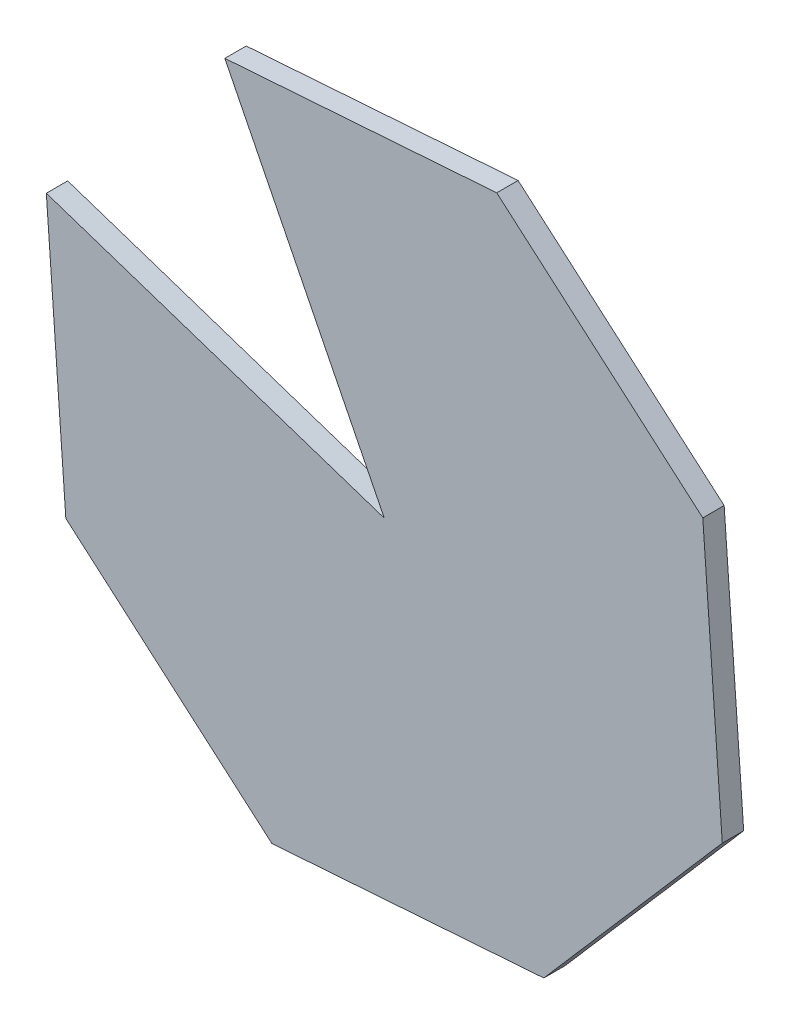
ISO-10303-21;
HEADER;
FILE_DESCRIPTION(('STEP AP214'),'2;1');
FILE_NAME('part.step','',(''),(''),'','','');
FILE_SCHEMA(('AUTOMOTIVE_DESIGN { 1 0 10303 214 1 1 1 1 }'));
ENDSEC;
DATA;
#1=APPLICATION_CONTEXT('core data for automotive mechanical design processes');
#2=APPLICATION_PROTOCOL_DEFINITION('international standard','automotive_design',2000,#1);
#3=PRODUCT_CONTEXT('',#1,'mechanical');
#4=PRODUCT('Part','Part','',(#3));
#5=PRODUCT_RELATED_PRODUCT_CATEGORY('part','',(#4));
#6=PRODUCT_DEFINITION_FORMATION('','',#4);
#7=PRODUCT_DEFINITION_CONTEXT('part definition',#1,'design');
#8=PRODUCT_DEFINITION('design','',#6,#7);
#9=PRODUCT_DEFINITION_SHAPE('','',#8);
#10=(LENGTH_UNIT() NAMED_UNIT(*) SI_UNIT(.MILLI.,.METRE.));
#11=(NAMED_UNIT(*) PLANE_ANGLE_UNIT() SI_UNIT($,.RADIAN.));
#12=(NAMED_UNIT(*) SI_UNIT($,.STERADIAN.) SOLID_ANGLE_UNIT());
#13=UNCERTAINTY_MEASURE_WITH_UNIT(LENGTH_MEASURE(1.E-05),#10,'distance_accuracy_value','');
#14=(GEOMETRIC_REPRESENTATION_CONTEXT(3) GLOBAL_UNCERTAINTY_ASSIGNED_CONTEXT((#13)) GLOBAL_UNIT_ASSIGNED_CONTEXT((#10,
#11,#12)) REPRESENTATION_CONTEXT('',''));
#15=CARTESIAN_POINT('',(0.,0.,0.));
#16=DIRECTION('',(0.,0.,1.));
#17=DIRECTION('',(1.,0.,0.));
#18=AXIS2_PLACEMENT_3D('',#15,#16,#17);
#19=CARTESIAN_POINT('',(0.,0.,3.));
#20=DIRECTION('',(-0.315635887196089,-0.948880385883246,0.));
#21=DIRECTION('',(0.948880385883246,-0.315635887196089,0.));
#22=AXIS2_PLACEMENT_3D('',#19,#20,#21);
#23=PLANE('',#22);
#24=DIRECTION('',(-0.948880385883246,0.315635887196089,0.));
#25=VECTOR('',#24,1.);
#26=CARTESIAN_POINT('',(0.,0.,0.));
#27=LINE('',#26,#25);
#28=CARTESIAN_POINT('',(0.,0.,0.));
#29=VERTEX_POINT('',#28);
#30=CARTESIAN_POINT('',(-47.4440192941623,15.7817943598045,0.));
#31=VERTEX_POINT('',#30);
#32=EDGE_CURVE('E135',#29,#31,#27,.T.);
#33=ORIENTED_EDGE('',*,*,#32,.T.);
#34=DIRECTION('',(0.,0.,-1.));
#35=VECTOR('',#34,1.);
#36=CARTESIAN_POINT('',(-47.4440192941623,15.7817943598045,3.));
#37=LINE('',#36,#35);
#38=CARTESIAN_POINT('',(-47.4440192941623,15.7817943598045,3.));
#39=VERTEX_POINT('',#38);
#40=EDGE_CURVE('E11',#39,#31,#37,.T.);
#41=ORIENTED_EDGE('',*,*,#40,.F.);
#42=DIRECTION('',(-0.948880385883246,0.315635887196089,0.));
#43=VECTOR('',#42,1.);
#44=CARTESIAN_POINT('',(0.,0.,3.));
#45=LINE('',#44,#43);
#46=CARTESIAN_POINT('',(0.,0.,3.));
#47=VERTEX_POINT('',#46);
#48=EDGE_CURVE('E151',#47,#39,#45,.T.);
#49=ORIENTED_EDGE('',*,*,#48,.F.);
#50=DIRECTION('',(0.,0.,-1.));
#51=VECTOR('',#50,1.);
#52=CARTESIAN_POINT('',(0.,0.,3.));
#53=LINE('',#52,#51);
#54=EDGE_CURVE('E131',#47,#29,#53,.T.);
#55=ORIENTED_EDGE('',*,*,#54,.T.);
#56=EDGE_LOOP('',(#33,#41,#49,#55));
#57=FACE_BOUND('',#56,.T.);
#58=ADVANCED_FACE('F33',(#57),#23,.F.);
#59=CARTESIAN_POINT('',(-47.4440192941623,15.7817943598045,3.));
#60=DIRECTION('',(0.997439792008742,0.0715112670672036,0.));
#61=DIRECTION('',(-0.0715112670672036,0.997439792008742,0.));
#62=AXIS2_PLACEMENT_3D('',#59,#60,#61);
#63=PLANE('',#62);
#64=DIRECTION('',(0.0715112670672036,-0.997439792008742,0.));
#65=VECTOR('',#64,1.);
#66=CARTESIAN_POINT('',(-47.4440192941623,15.7817943598045,0.));
#67=LINE('',#66,#65);
#68=CARTESIAN_POINT('',(-44.7074015807569,-22.3885739585382,0.));
#69=VERTEX_POINT('',#68);
#70=EDGE_CURVE('E138',#31,#69,#67,.T.);
#71=ORIENTED_EDGE('',*,*,#70,.T.);
#72=DIRECTION('',(0.,0.,-1.));
#73=VECTOR('',#72,1.);
#74=CARTESIAN_POINT('',(-44.7074015807569,-22.3885739585382,3.));
#75=LINE('',#74,#73);
#76=CARTESIAN_POINT('',(-44.7074015807569,-22.3885739585382,3.));
#77=VERTEX_POINT('',#76);
#78=EDGE_CURVE('E41',#77,#69,#75,.T.);
#79=ORIENTED_EDGE('',*,*,#78,.F.);
#80=DIRECTION('',(0.0715112670672036,-0.997439792008742,0.));
#81=VECTOR('',#80,1.);
#82=CARTESIAN_POINT('',(-47.4440192941623,15.7817943598045,3.));
#83=LINE('',#82,#81);
#84=EDGE_CURVE('E95',#39,#77,#83,.T.);
#85=ORIENTED_EDGE('',*,*,#84,.F.);
#86=ORIENTED_EDGE('',*,*,#40,.T.);
#87=EDGE_LOOP('',(#71,#79,#85,#86));
#88=FACE_BOUND('',#87,.T.);
#89=ADVANCED_FACE('F194',(#88),#63,.F.);
#90=CARTESIAN_POINT('',(-44.7074015807569,-22.3885739585382,3.));
#91=DIRECTION('',(0.654730338880219,0.755862542629143,0.));
#92=DIRECTION('',(-0.755862542629143,0.654730338880219,0.));
#93=AXIS2_PLACEMENT_3D('',#90,#91,#92);
#94=PLANE('',#93);
#95=DIRECTION('',(0.755862542629143,-0.654730338880219,0.));
#96=VECTOR('',#95,1.);
#97=CARTESIAN_POINT('',(-44.7074015807569,-22.3885739585382,0.));
#98=LINE('',#97,#96);
#99=CARTESIAN_POINT('',(-15.7817943598045,-47.4440192941623,0.));
#100=VERTEX_POINT('',#99);
#101=EDGE_CURVE('E140',#69,#100,#98,.T.);
#102=ORIENTED_EDGE('',*,*,#101,.T.);
#103=DIRECTION('',(0.,0.,-1.));
#104=VECTOR('',#103,1.);
#105=CARTESIAN_POINT('',(-15.7817943598045,-47.4440192941623,3.));
#106=LINE('',#105,#104);
#107=CARTESIAN_POINT('',(-15.7817943598045,-47.4440192941623,3.));
#108=VERTEX_POINT('',#107);
#109=EDGE_CURVE('E161',#108,#100,#106,.T.);
#110=ORIENTED_EDGE('',*,*,#109,.F.);
#111=DIRECTION('',(0.755862542629143,-0.654730338880219,0.));
#112=VECTOR('',#111,1.);
#113=CARTESIAN_POINT('',(-44.7074015807569,-22.3885739585382,3.));
#114=LINE('',#113,#112);
#115=EDGE_CURVE('E169',#77,#108,#114,.T.);
#116=ORIENTED_EDGE('',*,*,#115,.F.);
#117=ORIENTED_EDGE('',*,*,#78,.T.);
#118=EDGE_LOOP('',(#102,#110,#116,#117));
#119=FACE_BOUND('',#118,.T.);
#120=ADVANCED_FACE('F167',(#119),#94,.F.);
#121=CARTESIAN_POINT('',(-15.7817943598045,-47.4440192941623,3.));
#122=DIRECTION('',(-0.0715112670672032,0.997439792008742,0.));
#123=DIRECTION('',(-0.997439792008742,-0.0715112670672033,0.));
#124=AXIS2_PLACEMENT_3D('',#121,#122,#123);
#125=PLANE('',#124);
#126=DIRECTION('',(0.997439792008742,0.0715112670672033,0.));
#127=VECTOR('',#126,1.);
#128=CARTESIAN_POINT('',(-15.7817943598045,-47.4440192941623,0.));
#129=LINE('',#128,#127);
#130=CARTESIAN_POINT('',(22.3885739585382,-44.7074015807569,0.));
#131=VERTEX_POINT('',#130);
#132=EDGE_CURVE('E142',#100,#131,#129,.T.);
#133=ORIENTED_EDGE('',*,*,#132,.T.);
#134=DIRECTION('',(0.,0.,-1.));
#135=VECTOR('',#134,1.);
#136=CARTESIAN_POINT('',(22.3885739585382,-44.7074015807569,3.));
#137=LINE('',#136,#135);
#138=CARTESIAN_POINT('',(22.3885739585382,-44.7074015807569,3.));
#139=VERTEX_POINT('',#138);
#140=EDGE_CURVE('E158',#139,#131,#137,.T.);
#141=ORIENTED_EDGE('',*,*,#140,.F.);
#142=DIRECTION('',(0.997439792008742,0.0715112670672033,0.));
#143=VECTOR('',#142,1.);
#144=CARTESIAN_POINT('',(-15.7817943598045,-47.4440192941623,3.));
#145=LINE('',#144,#143);
#146=EDGE_CURVE('E185',#108,#139,#145,.T.);
#147=ORIENTED_EDGE('',*,*,#146,.F.);
#148=ORIENTED_EDGE('',*,*,#109,.T.);
#149=EDGE_LOOP('',(#133,#141,#147,#148));
#150=FACE_BOUND('',#149,.T.);
#151=ADVANCED_FACE('F178',(#150),#125,.F.);
#152=CARTESIAN_POINT('',(22.3885739585382,-44.7074015807569,3.));
#153=DIRECTION('',(-0.755862542629143,0.654730338880219,0.));
#154=DIRECTION('',(-0.65473033888022,-0.755862542629143,0.));
#155=AXIS2_PLACEMENT_3D('',#152,#153,#154);
#156=PLANE('',#155);
#157=DIRECTION('',(0.654730338880219,0.755862542629143,0.));
#158=VECTOR('',#157,1.);
#159=CARTESIAN_POINT('',(22.3885739585382,-44.7074015807569,0.));
#160=LINE('',#159,#158);
#161=CARTESIAN_POINT('',(47.4440192941623,-15.7817943598044,0.));
#162=VERTEX_POINT('',#161);
#163=EDGE_CURVE('E144',#131,#162,#160,.T.);
#164=ORIENTED_EDGE('',*,*,#163,.T.);
#165=DIRECTION('',(0.,0.,-1.));
#166=VECTOR('',#165,1.);
#167=CARTESIAN_POINT('',(47.4440192941623,-15.7817943598044,3.));
#168=LINE('',#167,#166);
#169=CARTESIAN_POINT('',(47.4440192941623,-15.7817943598044,3.));
#170=VERTEX_POINT('',#169);
#171=EDGE_CURVE('E155',#170,#162,#168,.T.);
#172=ORIENTED_EDGE('',*,*,#171,.F.);
#173=DIRECTION('',(0.654730338880219,0.755862542629143,0.));
#174=VECTOR('',#173,1.);
#175=CARTESIAN_POINT('',(22.3885739585382,-44.7074015807569,3.));
#176=LINE('',#175,#174);
#177=EDGE_CURVE('E184',#139,#170,#176,.T.);
#178=ORIENTED_EDGE('',*,*,#177,.F.);
#179=ORIENTED_EDGE('',*,*,#140,.T.);
#180=EDGE_LOOP('',(#164,#172,#178,#179));
#181=FACE_BOUND('',#180,.T.);
#182=ADVANCED_FACE('F182',(#181),#156,.F.);
#183=CARTESIAN_POINT('',(47.4440192941623,-15.7817943598044,3.));
#184=DIRECTION('',(-0.997439792008742,-0.0715112670672033,0.));
#185=DIRECTION('',(0.0715112670672033,-0.997439792008742,0.));
#186=AXIS2_PLACEMENT_3D('',#183,#184,#185);
#187=PLANE('',#186);
#188=DIRECTION('',(-0.0715112670672033,0.997439792008742,0.));
#189=VECTOR('',#188,1.);
#190=CARTESIAN_POINT('',(47.4440192941623,-15.7817943598044,0.));
#191=LINE('',#190,#189);
#192=CARTESIAN_POINT('',(44.7074015807569,22.3885739585382,0.));
#193=VERTEX_POINT('',#192);
#194=EDGE_CURVE('E146',#162,#193,#191,.T.);
#195=ORIENTED_EDGE('',*,*,#194,.T.);
#196=DIRECTION('',(0.,0.,-1.));
#197=VECTOR('',#196,1.);
#198=CARTESIAN_POINT('',(44.7074015807569,22.3885739585382,3.));
#199=LINE('',#198,#197);
#200=CARTESIAN_POINT('',(44.7074015807569,22.3885739585382,3.));
#201=VERTEX_POINT('',#200);
#202=EDGE_CURVE('E126',#201,#193,#199,.T.);
#203=ORIENTED_EDGE('',*,*,#202,.F.);
#204=DIRECTION('',(-0.0715112670672033,0.997439792008742,0.));
#205=VECTOR('',#204,1.);
#206=CARTESIAN_POINT('',(47.4440192941623,-15.7817943598044,3.));
#207=LINE('',#206,#205);
#208=EDGE_CURVE('E117',#170,#201,#207,.T.);
#209=ORIENTED_EDGE('',*,*,#208,.F.);
#210=ORIENTED_EDGE('',*,*,#171,.T.);
#211=EDGE_LOOP('',(#195,#203,#209,#210));
#212=FACE_BOUND('',#211,.T.);
#213=ADVANCED_FACE('F206',(#212),#187,.F.);
#214=CARTESIAN_POINT('',(44.7074015807569,22.3885739585382,3.));
#215=DIRECTION('',(-0.65473033888022,-0.755862542629143,0.));
#216=DIRECTION('',(0.755862542629143,-0.65473033888022,0.));
#217=AXIS2_PLACEMENT_3D('',#214,#215,#216);
#218=PLANE('',#217);
#219=DIRECTION('',(-0.755862542629143,0.65473033888022,0.));
#220=VECTOR('',#219,1.);
#221=CARTESIAN_POINT('',(44.7074015807569,22.3885739585382,0.));
#222=LINE('',#221,#220);
#223=CARTESIAN_POINT('',(15.7817943598045,47.4440192941623,0.));
#224=VERTEX_POINT('',#223);
#225=EDGE_CURVE('E125',#193,#224,#222,.T.);
#226=ORIENTED_EDGE('',*,*,#225,.T.);
#227=DIRECTION('',(0.,0.,-1.));
#228=VECTOR('',#227,1.);
#229=CARTESIAN_POINT('',(15.7817943598045,47.4440192941623,3.));
#230=LINE('',#229,#228);
#231=CARTESIAN_POINT('',(15.7817943598045,47.4440192941623,3.));
#232=VERTEX_POINT('',#231);
#233=EDGE_CURVE('E122',#232,#224,#230,.T.);
#234=ORIENTED_EDGE('',*,*,#233,.F.);
#235=DIRECTION('',(-0.755862542629143,0.65473033888022,0.));
#236=VECTOR('',#235,1.);
#237=CARTESIAN_POINT('',(44.7074015807569,22.3885739585382,3.));
#238=LINE('',#237,#236);
#239=EDGE_CURVE('E111',#201,#232,#238,.T.);
#240=ORIENTED_EDGE('',*,*,#239,.F.);
#241=ORIENTED_EDGE('',*,*,#202,.T.);
#242=EDGE_LOOP('',(#226,#234,#240,#241));
#243=FACE_BOUND('',#242,.T.);
#244=ADVANCED_FACE('F123',(#243),#218,.F.);
#245=CARTESIAN_POINT('',(15.7817943598045,47.4440192941623,3.));
#246=DIRECTION('',(0.0715112670672032,-0.997439792008742,0.));
#247=DIRECTION('',(0.997439792008742,0.0715112670672032,0.));
#248=AXIS2_PLACEMENT_3D('',#245,#246,#247);
#249=PLANE('',#248);
#250=DIRECTION('',(-0.997439792008742,-0.0715112670672032,0.));
#251=VECTOR('',#250,1.);
#252=CARTESIAN_POINT('',(15.7817943598045,47.4440192941623,0.));
#253=LINE('',#252,#251);
#254=CARTESIAN_POINT('',(-22.3885739585382,44.7074015807569,0.));
#255=VERTEX_POINT('',#254);
#256=EDGE_CURVE('E81',#224,#255,#253,.T.);
#257=ORIENTED_EDGE('',*,*,#256,.T.);
#258=DIRECTION('',(0.,0.,-1.));
#259=VECTOR('',#258,1.);
#260=CARTESIAN_POINT('',(-22.3885739585382,44.7074015807569,3.));
#261=LINE('',#260,#259);
#262=CARTESIAN_POINT('',(-22.3885739585382,44.7074015807569,3.));
#263=VERTEX_POINT('',#262);
#264=EDGE_CURVE('E127',#263,#255,#261,.T.);
#265=ORIENTED_EDGE('',*,*,#264,.F.);
#266=DIRECTION('',(-0.997439792008742,-0.0715112670672032,0.));
#267=VECTOR('',#266,1.);
#268=CARTESIAN_POINT('',(15.7817943598045,47.4440192941623,3.));
#269=LINE('',#268,#267);
#270=EDGE_CURVE('E115',#232,#263,#269,.T.);
#271=ORIENTED_EDGE('',*,*,#270,.F.);
#272=ORIENTED_EDGE('',*,*,#233,.T.);
#273=EDGE_LOOP('',(#257,#265,#271,#272));
#274=FACE_BOUND('',#273,.T.);
#275=ADVANCED_FACE('F129',(#274),#249,.F.);
#276=CARTESIAN_POINT('',(0.,0.,3.));
#277=DIRECTION('',(0.894148031615138,0.447771479170764,0.));
#278=DIRECTION('',(-0.447771479170764,0.894148031615138,0.));
#279=AXIS2_PLACEMENT_3D('',#276,#277,#278);
#280=PLANE('',#279);
#281=DIRECTION('',(0.447771479170764,-0.894148031615138,0.));
#282=VECTOR('',#281,1.);
#283=CARTESIAN_POINT('',(0.,0.,0.));
#284=LINE('',#283,#282);
#285=EDGE_CURVE('E87',#255,#29,#284,.T.);
#286=ORIENTED_EDGE('',*,*,#285,.T.);
#287=ORIENTED_EDGE('',*,*,#54,.F.);
#288=DIRECTION('',(0.447771479170764,-0.894148031615138,0.));
#289=VECTOR('',#288,1.);
#290=CARTESIAN_POINT('',(0.,0.,3.));
#291=LINE('',#290,#289);
#292=EDGE_CURVE('E49',#263,#47,#291,.T.);
#293=ORIENTED_EDGE('',*,*,#292,.F.);
#294=ORIENTED_EDGE('',*,*,#264,.T.);
#295=EDGE_LOOP('',(#286,#287,#293,#294));
#296=FACE_BOUND('',#295,.T.);
#297=ADVANCED_FACE('F214',(#296),#280,.F.);
#298=CARTESIAN_POINT('',(0.,0.,3.));
#299=DIRECTION('',(0.,0.,1.));
#300=DIRECTION('',(1.,0.,0.));
#301=AXIS2_PLACEMENT_3D('',#298,#299,#300);
#302=PLANE('',#301);
#303=ORIENTED_EDGE('',*,*,#48,.T.);
#304=ORIENTED_EDGE('',*,*,#84,.T.);
#305=ORIENTED_EDGE('',*,*,#115,.T.);
#306=ORIENTED_EDGE('',*,*,#146,.T.);
#307=ORIENTED_EDGE('',*,*,#177,.T.);
#308=ORIENTED_EDGE('',*,*,#208,.T.);
#309=ORIENTED_EDGE('',*,*,#239,.T.);
#310=ORIENTED_EDGE('',*,*,#270,.T.);
#311=ORIENTED_EDGE('',*,*,#292,.T.);
#312=EDGE_LOOP('',(#303,#304,#305,#306,#307,#308,#309,#310,#311));
#313=FACE_BOUND('',#312,.T.);
#314=ADVANCED_FACE('F113',(#313),#302,.T.);
#315=CARTESIAN_POINT('',(0.,0.,0.));
#316=DIRECTION('',(0.,0.,1.));
#317=DIRECTION('',(1.,0.,0.));
#318=AXIS2_PLACEMENT_3D('',#315,#316,#317);
#319=PLANE('',#318);
#320=ORIENTED_EDGE('',*,*,#32,.F.);
#321=ORIENTED_EDGE('',*,*,#285,.F.);
#322=ORIENTED_EDGE('',*,*,#256,.F.);
#323=ORIENTED_EDGE('',*,*,#225,.F.);
#324=ORIENTED_EDGE('',*,*,#194,.F.);
#325=ORIENTED_EDGE('',*,*,#163,.F.);
#326=ORIENTED_EDGE('',*,*,#132,.F.);
#327=ORIENTED_EDGE('',*,*,#101,.F.);
#328=ORIENTED_EDGE('',*,*,#70,.F.);
#329=EDGE_LOOP('',(#320,#321,#322,#323,#324,#325,#326,#327,#328));
#330=FACE_BOUND('',#329,.T.);
#331=ADVANCED_FACE('F173',(#330),#319,.F.);
#332=CLOSED_SHELL('',(#58,#89,#120,#151,#182,#213,#244,#275,#297,#314,#331));
#333=MANIFOLD_SOLID_BREP('B2',#332);
#334=ADVANCED_BREP_SHAPE_REPRESENTATION('',(#18,#333),#14);
#335=SHAPE_DEFINITION_REPRESENTATION(#9,#334);
ENDSEC;
END-ISO-10303-21;
